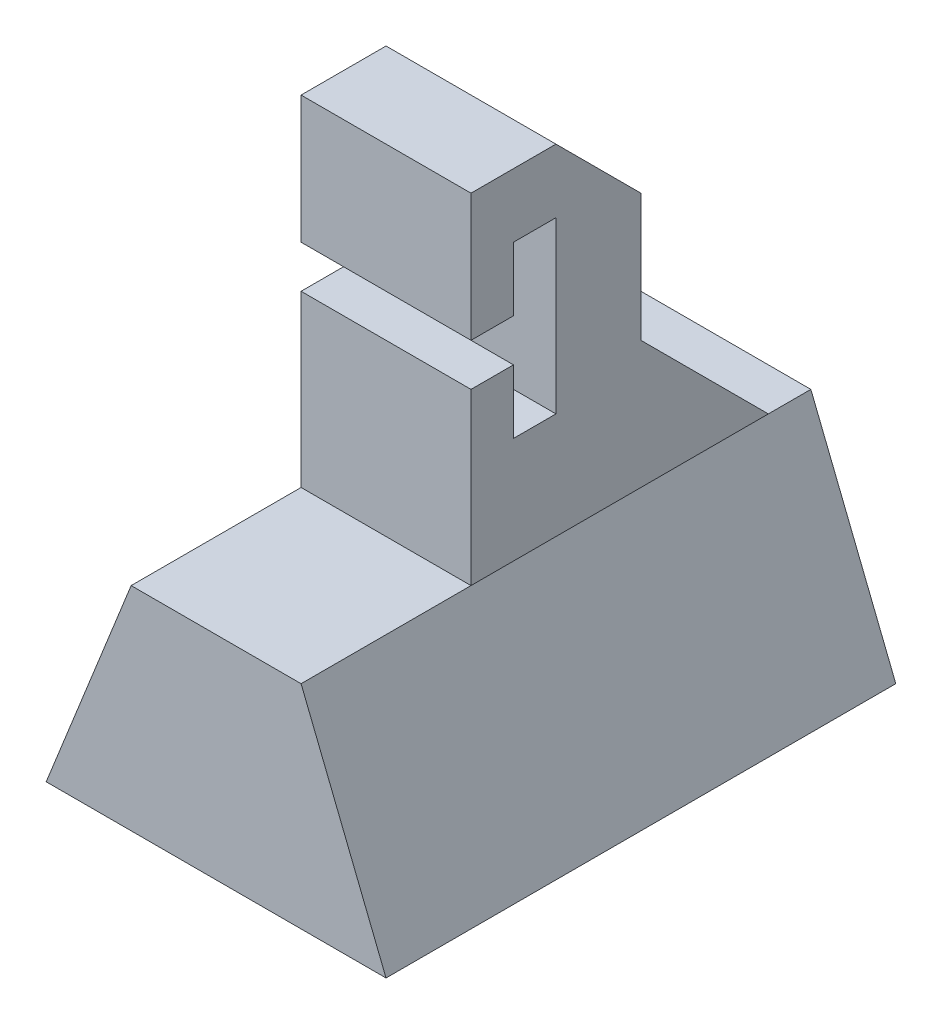
ISO-10303-21;
HEADER;
FILE_DESCRIPTION(('STEP AP214'),'2;1');
FILE_NAME('part.step','',(''),(''),'','','');
FILE_SCHEMA(('AUTOMOTIVE_DESIGN { 1 0 10303 214 1 1 1 1 }'));
ENDSEC;
DATA;
#1=APPLICATION_CONTEXT('core data for automotive mechanical design processes');
#2=APPLICATION_PROTOCOL_DEFINITION('international standard','automotive_design',2000,#1);
#3=PRODUCT_CONTEXT('',#1,'mechanical');
#4=PRODUCT('Part','Part','',(#3));
#5=PRODUCT_RELATED_PRODUCT_CATEGORY('part','',(#4));
#6=PRODUCT_DEFINITION_FORMATION('','',#4);
#7=PRODUCT_DEFINITION_CONTEXT('part definition',#1,'design');
#8=PRODUCT_DEFINITION('design','',#6,#7);
#9=PRODUCT_DEFINITION_SHAPE('','',#8);
#10=(LENGTH_UNIT() NAMED_UNIT(*) SI_UNIT(.MILLI.,.METRE.));
#11=(NAMED_UNIT(*) PLANE_ANGLE_UNIT() SI_UNIT($,.RADIAN.));
#12=(NAMED_UNIT(*) SI_UNIT($,.STERADIAN.) SOLID_ANGLE_UNIT());
#13=UNCERTAINTY_MEASURE_WITH_UNIT(LENGTH_MEASURE(1.E-05),#10,'distance_accuracy_value','');
#14=(GEOMETRIC_REPRESENTATION_CONTEXT(3) GLOBAL_UNCERTAINTY_ASSIGNED_CONTEXT((#13)) GLOBAL_UNIT_ASSIGNED_CONTEXT((#10,
#11,#12)) REPRESENTATION_CONTEXT('',''));
#15=CARTESIAN_POINT('',(0.,0.,0.));
#16=DIRECTION('',(0.,0.,1.));
#17=DIRECTION('',(1.,0.,0.));
#18=AXIS2_PLACEMENT_3D('',#15,#16,#17);
#19=CARTESIAN_POINT('',(-1.1304347826087,10.3913043478261,8.));
#20=DIRECTION('',(0.,0.,-1.));
#21=DIRECTION('',(-1.,0.,0.));
#22=AXIS2_PLACEMENT_3D('',#19,#20,#21);
#23=PLANE('',#22);
#24=DIRECTION('',(0.,-1.,0.));
#25=VECTOR('',#24,1.);
#26=CARTESIAN_POINT('',(2.8695652173913,10.3913043478261,8.));
#27=LINE('',#26,#25);
#28=CARTESIAN_POINT('',(2.8695652173913,6.39130434782609,8.));
#29=VERTEX_POINT('',#28);
#30=CARTESIAN_POINT('',(2.8695652173913,2.39130434782609,8.));
#31=VERTEX_POINT('',#30);
#32=EDGE_CURVE('E184',#29,#31,#27,.T.);
#33=ORIENTED_EDGE('',*,*,#32,.F.);
#34=DIRECTION('',(1.,0.,0.));
#35=VECTOR('',#34,1.);
#36=CARTESIAN_POINT('',(-15.1304347826087,6.39130434782609,8.));
#37=LINE('',#36,#35);
#38=CARTESIAN_POINT('',(-1.1304347826087,6.39130434782609,8.));
#39=VERTEX_POINT('',#38);
#40=EDGE_CURVE('E178',#39,#29,#37,.T.);
#41=ORIENTED_EDGE('',*,*,#40,.F.);
#42=DIRECTION('',(0.,-1.,0.));
#43=VECTOR('',#42,1.);
#44=CARTESIAN_POINT('',(-1.1304347826087,10.3913043478261,8.));
#45=LINE('',#44,#43);
#46=CARTESIAN_POINT('',(-1.1304347826087,2.39130434782609,8.));
#47=VERTEX_POINT('',#46);
#48=EDGE_CURVE('E183',#39,#47,#45,.T.);
#49=ORIENTED_EDGE('',*,*,#48,.T.);
#50=DIRECTION('',(1.,0.,0.));
#51=VECTOR('',#50,1.);
#52=CARTESIAN_POINT('',(-1.1304347826087,2.39130434782609,8.));
#53=LINE('',#52,#51);
#54=EDGE_CURVE('E251',#47,#31,#53,.T.);
#55=ORIENTED_EDGE('',*,*,#54,.T.);
#56=EDGE_LOOP('',(#33,#41,#49,#55));
#57=FACE_BOUND('',#56,.T.);
#58=ADVANCED_FACE('F33',(#57),#23,.F.);
#59=CARTESIAN_POINT('',(2.8695652173913,2.39130434782609,12.));
#60=DIRECTION('',(0.,-1.,0.));
#61=DIRECTION('',(1.,0.,0.));
#62=AXIS2_PLACEMENT_3D('',#59,#60,#61);
#63=PLANE('',#62);
#64=DIRECTION('',(0.,0.,-1.));
#65=VECTOR('',#64,1.);
#66=CARTESIAN_POINT('',(-1.1304347826087,2.39130434782609,12.));
#67=LINE('',#66,#65);
#68=CARTESIAN_POINT('',(-1.1304347826087,2.39130434782609,1.00000000000001));
#69=VERTEX_POINT('',#68);
#70=CARTESIAN_POINT('',(-1.1304347826087,2.39130434782609,0.));
#71=VERTEX_POINT('',#70);
#72=EDGE_CURVE('E202',#69,#71,#67,.T.);
#73=ORIENTED_EDGE('',*,*,#72,.F.);
#74=DIRECTION('',(1.,0.,0.));
#75=VECTOR('',#74,1.);
#76=CARTESIAN_POINT('',(2.8695652173913,2.39130434782609,1.00000000000001));
#77=LINE('',#76,#75);
#78=CARTESIAN_POINT('',(2.8695652173913,2.39130434782609,1.00000000000001));
#79=VERTEX_POINT('',#78);
#80=EDGE_CURVE('E228',#69,#79,#77,.T.);
#81=ORIENTED_EDGE('',*,*,#80,.T.);
#82=DIRECTION('',(0.,0.,-1.));
#83=VECTOR('',#82,1.);
#84=CARTESIAN_POINT('',(2.8695652173913,2.39130434782609,12.));
#85=LINE('',#84,#83);
#86=CARTESIAN_POINT('',(2.8695652173913,2.39130434782609,0.));
#87=VERTEX_POINT('',#86);
#88=EDGE_CURVE('E215',#79,#87,#85,.T.);
#89=ORIENTED_EDGE('',*,*,#88,.T.);
#90=DIRECTION('',(-1.,0.,0.));
#91=VECTOR('',#90,1.);
#92=CARTESIAN_POINT('',(2.8695652173913,2.39130434782609,0.));
#93=LINE('',#92,#91);
#94=EDGE_CURVE('E196',#87,#71,#93,.T.);
#95=ORIENTED_EDGE('',*,*,#94,.T.);
#96=EDGE_LOOP('',(#73,#81,#89,#95));
#97=FACE_BOUND('',#96,.T.);
#98=ADVANCED_FACE('F279',(#97),#63,.F.);
#99=ORIENTED_EDGE('',*,*,#54,.F.);
#100=CARTESIAN_POINT('',(-1.1304347826087,2.39130434782609,12.));
#101=VERTEX_POINT('',#100);
#102=EDGE_CURVE('E212',#101,#47,#67,.T.);
#103=ORIENTED_EDGE('',*,*,#102,.F.);
#104=DIRECTION('',(-1.,0.,0.));
#105=VECTOR('',#104,1.);
#106=CARTESIAN_POINT('',(2.8695652173913,2.39130434782609,12.));
#107=LINE('',#106,#105);
#108=CARTESIAN_POINT('',(2.8695652173913,2.39130434782609,12.));
#109=VERTEX_POINT('',#108);
#110=EDGE_CURVE('E200',#109,#101,#107,.T.);
#111=ORIENTED_EDGE('',*,*,#110,.F.);
#112=EDGE_CURVE('E216',#109,#31,#85,.T.);
#113=ORIENTED_EDGE('',*,*,#112,.T.);
#114=EDGE_LOOP('',(#99,#103,#111,#113));
#115=FACE_BOUND('',#114,.T.);
#116=ADVANCED_FACE('F297',(#115),#63,.F.);
#117=CARTESIAN_POINT('',(-1.1304347826087,2.39130434782609,12.));
#118=DIRECTION('',(0.928476690885259,-0.371390676354104,0.));
#119=DIRECTION('',(0.371390676354104,0.928476690885259,0.));
#120=AXIS2_PLACEMENT_3D('',#117,#118,#119);
#121=PLANE('',#120);
#122=DIRECTION('',(-0.371390676354104,-0.928476690885259,0.));
#123=VECTOR('',#122,1.);
#124=CARTESIAN_POINT('',(-1.1304347826087,2.39130434782609,0.));
#125=LINE('',#124,#123);
#126=CARTESIAN_POINT('',(-3.1304347826087,-2.60869565217391,0.));
#127=VERTEX_POINT('',#126);
#128=EDGE_CURVE('E191',#71,#127,#125,.T.);
#129=ORIENTED_EDGE('',*,*,#128,.T.);
#130=DIRECTION('',(0.,0.,-1.));
#131=VECTOR('',#130,1.);
#132=CARTESIAN_POINT('',(-3.1304347826087,-2.60869565217391,12.));
#133=LINE('',#132,#131);
#134=CARTESIAN_POINT('',(-3.1304347826087,-2.60869565217391,12.));
#135=VERTEX_POINT('',#134);
#136=EDGE_CURVE('E222',#135,#127,#133,.T.);
#137=ORIENTED_EDGE('',*,*,#136,.F.);
#138=DIRECTION('',(-0.371390676354104,-0.928476690885259,0.));
#139=VECTOR('',#138,1.);
#140=CARTESIAN_POINT('',(-1.1304347826087,2.39130434782609,12.));
#141=LINE('',#140,#139);
#142=EDGE_CURVE('E192',#101,#135,#141,.T.);
#143=ORIENTED_EDGE('',*,*,#142,.F.);
#144=ORIENTED_EDGE('',*,*,#102,.T.);
#145=DIRECTION('',(0.,0.,1.));
#146=VECTOR('',#145,1.);
#147=CARTESIAN_POINT('',(-1.1304347826087,2.39130434782609,4.));
#148=LINE('',#147,#146);
#149=EDGE_CURVE('E259',#69,#47,#148,.T.);
#150=ORIENTED_EDGE('',*,*,#149,.F.);
#151=ORIENTED_EDGE('',*,*,#72,.T.);
#152=EDGE_LOOP('',(#129,#137,#143,#144,#150,#151));
#153=FACE_BOUND('',#152,.T.);
#154=ADVANCED_FACE('F275',(#153),#121,.F.);
#155=CARTESIAN_POINT('',(-3.1304347826087,-2.60869565217391,12.));
#156=DIRECTION('',(0.,1.,0.));
#157=DIRECTION('',(0.,0.,1.));
#158=AXIS2_PLACEMENT_3D('',#155,#156,#157);
#159=PLANE('',#158);
#160=DIRECTION('',(1.,0.,0.));
#161=VECTOR('',#160,1.);
#162=CARTESIAN_POINT('',(-3.1304347826087,-2.60869565217391,0.));
#163=LINE('',#162,#161);
#164=CARTESIAN_POINT('',(4.8695652173913,-2.60869565217391,0.));
#165=VERTEX_POINT('',#164);
#166=EDGE_CURVE('E205',#127,#165,#163,.T.);
#167=ORIENTED_EDGE('',*,*,#166,.T.);
#168=DIRECTION('',(0.,0.,-1.));
#169=VECTOR('',#168,1.);
#170=CARTESIAN_POINT('',(4.8695652173913,-2.60869565217391,12.));
#171=LINE('',#170,#169);
#172=CARTESIAN_POINT('',(4.8695652173913,-2.60869565217391,12.));
#173=VERTEX_POINT('',#172);
#174=EDGE_CURVE('E219',#173,#165,#171,.T.);
#175=ORIENTED_EDGE('',*,*,#174,.F.);
#176=DIRECTION('',(1.,0.,0.));
#177=VECTOR('',#176,1.);
#178=CARTESIAN_POINT('',(-3.1304347826087,-2.60869565217391,12.));
#179=LINE('',#178,#177);
#180=EDGE_CURVE('E195',#135,#173,#179,.T.);
#181=ORIENTED_EDGE('',*,*,#180,.F.);
#182=ORIENTED_EDGE('',*,*,#136,.T.);
#183=EDGE_LOOP('',(#167,#175,#181,#182));
#184=FACE_BOUND('',#183,.T.);
#185=ADVANCED_FACE('F288',(#184),#159,.F.);
#186=CARTESIAN_POINT('',(4.8695652173913,-2.60869565217391,12.));
#187=DIRECTION('',(-0.928476690885259,-0.371390676354103,0.));
#188=DIRECTION('',(0.371390676354104,-0.928476690885259,0.));
#189=AXIS2_PLACEMENT_3D('',#186,#187,#188);
#190=PLANE('',#189);
#191=DIRECTION('',(-0.371390676354104,0.928476690885259,0.));
#192=VECTOR('',#191,1.);
#193=CARTESIAN_POINT('',(4.8695652173913,-2.60869565217391,0.));
#194=LINE('',#193,#192);
#195=EDGE_CURVE('E207',#165,#87,#194,.T.);
#196=ORIENTED_EDGE('',*,*,#195,.T.);
#197=ORIENTED_EDGE('',*,*,#88,.F.);
#198=DIRECTION('',(0.,0.,-1.));
#199=VECTOR('',#198,1.);
#200=CARTESIAN_POINT('',(2.8695652173913,2.39130434782609,4.));
#201=LINE('',#200,#199);
#202=EDGE_CURVE('E248',#31,#79,#201,.T.);
#203=ORIENTED_EDGE('',*,*,#202,.F.);
#204=ORIENTED_EDGE('',*,*,#112,.F.);
#205=DIRECTION('',(-0.371390676354104,0.928476690885259,0.));
#206=VECTOR('',#205,1.);
#207=CARTESIAN_POINT('',(4.8695652173913,-2.60869565217391,12.));
#208=LINE('',#207,#206);
#209=EDGE_CURVE('E198',#173,#109,#208,.T.);
#210=ORIENTED_EDGE('',*,*,#209,.F.);
#211=ORIENTED_EDGE('',*,*,#174,.T.);
#212=EDGE_LOOP('',(#196,#197,#203,#204,#210,#211));
#213=FACE_BOUND('',#212,.T.);
#214=ADVANCED_FACE('F393',(#213),#190,.F.);
#215=CARTESIAN_POINT('',(0.,0.,12.));
#216=DIRECTION('',(0.,0.,1.));
#217=DIRECTION('',(1.,0.,0.));
#218=AXIS2_PLACEMENT_3D('',#215,#216,#217);
#219=PLANE('',#218);
#220=ORIENTED_EDGE('',*,*,#142,.T.);
#221=ORIENTED_EDGE('',*,*,#180,.T.);
#222=ORIENTED_EDGE('',*,*,#209,.T.);
#223=ORIENTED_EDGE('',*,*,#110,.T.);
#224=EDGE_LOOP('',(#220,#221,#222,#223));
#225=FACE_BOUND('',#224,.T.);
#226=ADVANCED_FACE('F292',(#225),#219,.T.);
#227=CARTESIAN_POINT('',(0.,0.,0.));
#228=DIRECTION('',(0.,0.,1.));
#229=DIRECTION('',(1.,0.,0.));
#230=AXIS2_PLACEMENT_3D('',#227,#228,#229);
#231=PLANE('',#230);
#232=ORIENTED_EDGE('',*,*,#128,.F.);
#233=ORIENTED_EDGE('',*,*,#94,.F.);
#234=ORIENTED_EDGE('',*,*,#195,.F.);
#235=ORIENTED_EDGE('',*,*,#166,.F.);
#236=EDGE_LOOP('',(#232,#233,#234,#235));
#237=FACE_BOUND('',#236,.T.);
#238=ADVANCED_FACE('F285',(#237),#231,.F.);
#239=CARTESIAN_POINT('',(-1.1304347826087,10.3913043478261,4.));
#240=DIRECTION('',(1.,0.,0.));
#241=DIRECTION('',(0.,1.,0.));
#242=AXIS2_PLACEMENT_3D('',#239,#240,#241);
#243=PLANE('',#242);
#244=DIRECTION('',(0.,0.,1.));
#245=VECTOR('',#244,1.);
#246=CARTESIAN_POINT('',(-1.1304347826087,10.3913043478261,4.));
#247=LINE('',#246,#245);
#248=CARTESIAN_POINT('',(-1.1304347826087,10.3913043478261,6.));
#249=VERTEX_POINT('',#248);
#250=CARTESIAN_POINT('',(-1.1304347826087,10.3913043478261,8.));
#251=VERTEX_POINT('',#250);
#252=EDGE_CURVE('E243',#249,#251,#247,.T.);
#253=ORIENTED_EDGE('',*,*,#252,.F.);
#254=DIRECTION('',(0.,-0.707106781186549,-0.707106781186546));
#255=VECTOR('',#254,1.);
#256=CARTESIAN_POINT('',(-1.1304347826087,10.3913043478261,6.));
#257=LINE('',#256,#255);
#258=CARTESIAN_POINT('',(-1.1304347826087,8.39130434782609,4.));
#259=VERTEX_POINT('',#258);
#260=EDGE_CURVE('E55',#249,#259,#257,.T.);
#261=ORIENTED_EDGE('',*,*,#260,.T.);
#262=DIRECTION('',(0.,-1.,0.));
#263=VECTOR('',#262,1.);
#264=CARTESIAN_POINT('',(-1.1304347826087,10.3913043478261,4.));
#265=LINE('',#264,#263);
#266=CARTESIAN_POINT('',(-1.1304347826087,5.39130434782611,4.));
#267=VERTEX_POINT('',#266);
#268=EDGE_CURVE('E258',#259,#267,#265,.T.);
#269=ORIENTED_EDGE('',*,*,#268,.T.);
#270=DIRECTION('',(0.,0.707106781186551,0.707106781186544));
#271=VECTOR('',#270,1.);
#272=CARTESIAN_POINT('',(-1.1304347826087,7.89130434782613,6.49999999999999));
#273=LINE('',#272,#271);
#274=EDGE_CURVE('E231',#267,#69,#273,.F.);
#275=ORIENTED_EDGE('',*,*,#274,.T.);
#276=ORIENTED_EDGE('',*,*,#149,.T.);
#277=ORIENTED_EDGE('',*,*,#48,.F.);
#278=DIRECTION('',(0.,0.,-1.));
#279=VECTOR('',#278,1.);
#280=CARTESIAN_POINT('',(-1.1304347826087,6.39130434782609,4.));
#281=LINE('',#280,#279);
#282=CARTESIAN_POINT('',(-1.1304347826087,6.39130434782609,7.));
#283=VERTEX_POINT('',#282);
#284=EDGE_CURVE('E314',#39,#283,#281,.T.);
#285=ORIENTED_EDGE('',*,*,#284,.T.);
#286=DIRECTION('',(0.,-1.,0.));
#287=VECTOR('',#286,1.);
#288=CARTESIAN_POINT('',(-1.1304347826087,10.3913043478261,7.));
#289=LINE('',#288,#287);
#290=CARTESIAN_POINT('',(-1.1304347826087,4.89130434782609,7.));
#291=VERTEX_POINT('',#290);
#292=EDGE_CURVE('E317',#283,#291,#289,.T.);
#293=ORIENTED_EDGE('',*,*,#292,.T.);
#294=DIRECTION('',(0.,0.,-1.));
#295=VECTOR('',#294,1.);
#296=CARTESIAN_POINT('',(-1.1304347826087,4.89130434782609,4.));
#297=LINE('',#296,#295);
#298=CARTESIAN_POINT('',(-1.1304347826087,4.89130434782609,6.));
#299=VERTEX_POINT('',#298);
#300=EDGE_CURVE('E320',#291,#299,#297,.T.);
#301=ORIENTED_EDGE('',*,*,#300,.T.);
#302=DIRECTION('',(0.,1.,0.));
#303=VECTOR('',#302,1.);
#304=CARTESIAN_POINT('',(-1.1304347826087,10.3913043478261,6.));
#305=LINE('',#304,#303);
#306=CARTESIAN_POINT('',(-1.1304347826087,8.89130434782609,6.));
#307=VERTEX_POINT('',#306);
#308=EDGE_CURVE('E323',#299,#307,#305,.T.);
#309=ORIENTED_EDGE('',*,*,#308,.T.);
#310=DIRECTION('',(0.,0.,1.));
#311=VECTOR('',#310,1.);
#312=CARTESIAN_POINT('',(-1.1304347826087,8.89130434782609,4.));
#313=LINE('',#312,#311);
#314=CARTESIAN_POINT('',(-1.1304347826087,8.89130434782609,7.));
#315=VERTEX_POINT('',#314);
#316=EDGE_CURVE('E325',#307,#315,#313,.T.);
#317=ORIENTED_EDGE('',*,*,#316,.T.);
#318=DIRECTION('',(0.,-1.,0.));
#319=VECTOR('',#318,1.);
#320=CARTESIAN_POINT('',(-1.1304347826087,10.3913043478261,7.));
#321=LINE('',#320,#319);
#322=CARTESIAN_POINT('',(-1.1304347826087,7.39130434782609,7.));
#323=VERTEX_POINT('',#322);
#324=EDGE_CURVE('E254',#315,#323,#321,.T.);
#325=ORIENTED_EDGE('',*,*,#324,.T.);
#326=DIRECTION('',(0.,0.,1.));
#327=VECTOR('',#326,1.);
#328=CARTESIAN_POINT('',(-1.1304347826087,7.39130434782609,4.));
#329=LINE('',#328,#327);
#330=CARTESIAN_POINT('',(-1.1304347826087,7.39130434782609,8.));
#331=VERTEX_POINT('',#330);
#332=EDGE_CURVE('E312',#323,#331,#329,.T.);
#333=ORIENTED_EDGE('',*,*,#332,.T.);
#334=EDGE_CURVE('E177',#251,#331,#45,.T.);
#335=ORIENTED_EDGE('',*,*,#334,.F.);
#336=EDGE_LOOP('',(#253,#261,#269,#275,#276,#277,#285,#293,#301,#309,#317,#325,#333,#335));
#337=FACE_BOUND('',#336,.T.);
#338=ADVANCED_FACE('F246',(#337),#243,.F.);
#339=ORIENTED_EDGE('',*,*,#334,.T.);
#340=DIRECTION('',(1.,0.,0.));
#341=VECTOR('',#340,1.);
#342=CARTESIAN_POINT('',(-15.1304347826087,7.39130434782609,8.));
#343=LINE('',#342,#341);
#344=CARTESIAN_POINT('',(2.8695652173913,7.39130434782609,8.));
#345=VERTEX_POINT('',#344);
#346=EDGE_CURVE('E159',#331,#345,#343,.T.);
#347=ORIENTED_EDGE('',*,*,#346,.T.);
#348=CARTESIAN_POINT('',(2.8695652173913,10.3913043478261,8.));
#349=VERTEX_POINT('',#348);
#350=EDGE_CURVE('E174',#349,#345,#27,.T.);
#351=ORIENTED_EDGE('',*,*,#350,.F.);
#352=DIRECTION('',(1.,0.,0.));
#353=VECTOR('',#352,1.);
#354=CARTESIAN_POINT('',(-1.1304347826087,10.3913043478261,8.));
#355=LINE('',#354,#353);
#356=EDGE_CURVE('E247',#251,#349,#355,.T.);
#357=ORIENTED_EDGE('',*,*,#356,.F.);
#358=EDGE_LOOP('',(#339,#347,#351,#357));
#359=FACE_BOUND('',#358,.T.);
#360=ADVANCED_FACE('F172',(#359),#23,.F.);
#361=CARTESIAN_POINT('',(2.8695652173913,10.3913043478261,4.));
#362=DIRECTION('',(-1.,0.,0.));
#363=DIRECTION('',(0.,-1.,0.));
#364=AXIS2_PLACEMENT_3D('',#361,#362,#363);
#365=PLANE('',#364);
#366=DIRECTION('',(0.,-1.,0.));
#367=VECTOR('',#366,1.);
#368=CARTESIAN_POINT('',(2.8695652173913,10.3913043478261,4.));
#369=LINE('',#368,#367);
#370=CARTESIAN_POINT('',(2.8695652173913,8.39130434782609,4.));
#371=VERTEX_POINT('',#370);
#372=CARTESIAN_POINT('',(2.8695652173913,5.39130434782611,4.));
#373=VERTEX_POINT('',#372);
#374=EDGE_CURVE('E187',#371,#373,#369,.T.);
#375=ORIENTED_EDGE('',*,*,#374,.F.);
#376=DIRECTION('',(0.,0.707106781186549,0.707106781186546));
#377=VECTOR('',#376,1.);
#378=CARTESIAN_POINT('',(2.8695652173913,10.3913043478261,6.));
#379=LINE('',#378,#377);
#380=CARTESIAN_POINT('',(2.8695652173913,10.3913043478261,6.));
#381=VERTEX_POINT('',#380);
#382=EDGE_CURVE('E11',#371,#381,#379,.T.);
#383=ORIENTED_EDGE('',*,*,#382,.T.);
#384=DIRECTION('',(0.,0.,-1.));
#385=VECTOR('',#384,1.);
#386=CARTESIAN_POINT('',(2.8695652173913,10.3913043478261,4.));
#387=LINE('',#386,#385);
#388=EDGE_CURVE('E182',#349,#381,#387,.T.);
#389=ORIENTED_EDGE('',*,*,#388,.F.);
#390=ORIENTED_EDGE('',*,*,#350,.T.);
#391=DIRECTION('',(0.,0.,1.));
#392=VECTOR('',#391,1.);
#393=CARTESIAN_POINT('',(2.8695652173913,7.39130434782609,7.));
#394=LINE('',#393,#392);
#395=CARTESIAN_POINT('',(2.8695652173913,7.39130434782609,7.));
#396=VERTEX_POINT('',#395);
#397=EDGE_CURVE('E156',#396,#345,#394,.T.);
#398=ORIENTED_EDGE('',*,*,#397,.F.);
#399=DIRECTION('',(0.,-1.,0.));
#400=VECTOR('',#399,1.);
#401=CARTESIAN_POINT('',(2.8695652173913,8.89130434782609,7.));
#402=LINE('',#401,#400);
#403=CARTESIAN_POINT('',(2.8695652173913,8.89130434782609,7.));
#404=VERTEX_POINT('',#403);
#405=EDGE_CURVE('E167',#404,#396,#402,.T.);
#406=ORIENTED_EDGE('',*,*,#405,.F.);
#407=DIRECTION('',(0.,0.,1.));
#408=VECTOR('',#407,1.);
#409=CARTESIAN_POINT('',(2.8695652173913,8.89130434782609,7.));
#410=LINE('',#409,#408);
#411=CARTESIAN_POINT('',(2.8695652173913,8.89130434782609,6.));
#412=VERTEX_POINT('',#411);
#413=EDGE_CURVE('E311',#412,#404,#410,.T.);
#414=ORIENTED_EDGE('',*,*,#413,.F.);
#415=DIRECTION('',(0.,1.,0.));
#416=VECTOR('',#415,1.);
#417=CARTESIAN_POINT('',(2.8695652173913,8.89130434782609,6.));
#418=LINE('',#417,#416);
#419=CARTESIAN_POINT('',(2.8695652173913,4.89130434782609,6.));
#420=VERTEX_POINT('',#419);
#421=EDGE_CURVE('E359',#420,#412,#418,.T.);
#422=ORIENTED_EDGE('',*,*,#421,.F.);
#423=DIRECTION('',(0.,0.,-1.));
#424=VECTOR('',#423,1.);
#425=CARTESIAN_POINT('',(2.8695652173913,4.89130434782609,7.));
#426=LINE('',#425,#424);
#427=CARTESIAN_POINT('',(2.8695652173913,4.89130434782609,7.));
#428=VERTEX_POINT('',#427);
#429=EDGE_CURVE('E350',#428,#420,#426,.T.);
#430=ORIENTED_EDGE('',*,*,#429,.F.);
#431=DIRECTION('',(0.,-1.,0.));
#432=VECTOR('',#431,1.);
#433=CARTESIAN_POINT('',(2.8695652173913,6.39130434782609,7.));
#434=LINE('',#433,#432);
#435=CARTESIAN_POINT('',(2.8695652173913,6.39130434782609,7.));
#436=VERTEX_POINT('',#435);
#437=EDGE_CURVE('E354',#436,#428,#434,.T.);
#438=ORIENTED_EDGE('',*,*,#437,.F.);
#439=DIRECTION('',(0.,0.,-1.));
#440=VECTOR('',#439,1.);
#441=CARTESIAN_POINT('',(2.8695652173913,6.39130434782609,7.));
#442=LINE('',#441,#440);
#443=EDGE_CURVE('E166',#29,#436,#442,.T.);
#444=ORIENTED_EDGE('',*,*,#443,.F.);
#445=ORIENTED_EDGE('',*,*,#32,.T.);
#446=ORIENTED_EDGE('',*,*,#202,.T.);
#447=DIRECTION('',(0.,-0.707106781186551,-0.707106781186544));
#448=VECTOR('',#447,1.);
#449=CARTESIAN_POINT('',(2.8695652173913,7.89130434782613,6.49999999999999));
#450=LINE('',#449,#448);
#451=EDGE_CURVE('E234',#79,#373,#450,.F.);
#452=ORIENTED_EDGE('',*,*,#451,.T.);
#453=EDGE_LOOP('',(#375,#383,#389,#390,#398,#406,#414,#422,#430,#438,#444,#445,#446,#452));
#454=FACE_BOUND('',#453,.T.);
#455=ADVANCED_FACE('F180',(#454),#365,.F.);
#456=CARTESIAN_POINT('',(-1.1304347826087,10.3913043478261,4.));
#457=DIRECTION('',(0.,0.,1.));
#458=DIRECTION('',(1.,0.,0.));
#459=AXIS2_PLACEMENT_3D('',#456,#457,#458);
#460=PLANE('',#459);
#461=ORIENTED_EDGE('',*,*,#268,.F.);
#462=DIRECTION('',(1.,0.,0.));
#463=VECTOR('',#462,1.);
#464=CARTESIAN_POINT('',(2.8695652173913,8.39130434782609,4.));
#465=LINE('',#464,#463);
#466=EDGE_CURVE('E41',#259,#371,#465,.T.);
#467=ORIENTED_EDGE('',*,*,#466,.T.);
#468=ORIENTED_EDGE('',*,*,#374,.T.);
#469=DIRECTION('',(-1.,0.,0.));
#470=VECTOR('',#469,1.);
#471=CARTESIAN_POINT('',(-1.1304347826087,5.39130434782611,4.));
#472=LINE('',#471,#470);
#473=EDGE_CURVE('E225',#373,#267,#472,.T.);
#474=ORIENTED_EDGE('',*,*,#473,.T.);
#475=EDGE_LOOP('',(#461,#467,#468,#474));
#476=FACE_BOUND('',#475,.T.);
#477=ADVANCED_FACE('F264',(#476),#460,.F.);
#478=CARTESIAN_POINT('',(0.,10.3913043478261,0.));
#479=DIRECTION('',(0.,1.,0.));
#480=DIRECTION('',(-1.,0.,0.));
#481=AXIS2_PLACEMENT_3D('',#478,#479,#480);
#482=PLANE('',#481);
#483=ORIENTED_EDGE('',*,*,#388,.T.);
#484=DIRECTION('',(-1.,0.,0.));
#485=VECTOR('',#484,1.);
#486=CARTESIAN_POINT('',(-1.1304347826087,10.3913043478261,6.));
#487=LINE('',#486,#485);
#488=EDGE_CURVE('E237',#381,#249,#487,.T.);
#489=ORIENTED_EDGE('',*,*,#488,.T.);
#490=ORIENTED_EDGE('',*,*,#252,.T.);
#491=ORIENTED_EDGE('',*,*,#356,.T.);
#492=EDGE_LOOP('',(#483,#489,#490,#491));
#493=FACE_BOUND('',#492,.T.);
#494=ADVANCED_FACE('F242',(#493),#482,.T.);
#495=CARTESIAN_POINT('',(-1.1304347826087,5.39130434782611,4.));
#496=DIRECTION('',(0.,0.707106781186544,-0.707106781186551));
#497=DIRECTION('',(1.,0.,0.));
#498=AXIS2_PLACEMENT_3D('',#495,#496,#497);
#499=PLANE('',#498);
#500=ORIENTED_EDGE('',*,*,#451,.F.);
#501=ORIENTED_EDGE('',*,*,#80,.F.);
#502=ORIENTED_EDGE('',*,*,#274,.F.);
#503=ORIENTED_EDGE('',*,*,#473,.F.);
#504=EDGE_LOOP('',(#500,#501,#502,#503));
#505=FACE_BOUND('',#504,.T.);
#506=ADVANCED_FACE('F270',(#505),#499,.T.);
#507=CARTESIAN_POINT('',(-15.1304347826087,8.89130434782609,7.));
#508=DIRECTION('',(0.,0.,1.));
#509=DIRECTION('',(1.,0.,0.));
#510=AXIS2_PLACEMENT_3D('',#507,#508,#509);
#511=PLANE('',#510);
#512=DIRECTION('',(1.,0.,0.));
#513=VECTOR('',#512,1.);
#514=CARTESIAN_POINT('',(-15.1304347826087,8.89130434782609,7.));
#515=LINE('',#514,#513);
#516=EDGE_CURVE('E315',#315,#404,#515,.T.);
#517=ORIENTED_EDGE('',*,*,#516,.T.);
#518=ORIENTED_EDGE('',*,*,#405,.T.);
#519=DIRECTION('',(1.,0.,0.));
#520=VECTOR('',#519,1.);
#521=CARTESIAN_POINT('',(-15.1304347826087,7.39130434782609,7.));
#522=LINE('',#521,#520);
#523=EDGE_CURVE('E162',#323,#396,#522,.T.);
#524=ORIENTED_EDGE('',*,*,#523,.F.);
#525=ORIENTED_EDGE('',*,*,#324,.F.);
#526=EDGE_LOOP('',(#517,#518,#524,#525));
#527=FACE_BOUND('',#526,.T.);
#528=ADVANCED_FACE('F330',(#527),#511,.F.);
#529=CARTESIAN_POINT('',(-15.1304347826087,8.89130434782609,7.));
#530=DIRECTION('',(0.,1.,0.));
#531=DIRECTION('',(-1.,0.,0.));
#532=AXIS2_PLACEMENT_3D('',#529,#530,#531);
#533=PLANE('',#532);
#534=DIRECTION('',(1.,0.,0.));
#535=VECTOR('',#534,1.);
#536=CARTESIAN_POINT('',(-15.1304347826087,8.89130434782609,6.));
#537=LINE('',#536,#535);
#538=EDGE_CURVE('E336',#307,#412,#537,.T.);
#539=ORIENTED_EDGE('',*,*,#538,.T.);
#540=ORIENTED_EDGE('',*,*,#413,.T.);
#541=ORIENTED_EDGE('',*,*,#516,.F.);
#542=ORIENTED_EDGE('',*,*,#316,.F.);
#543=EDGE_LOOP('',(#539,#540,#541,#542));
#544=FACE_BOUND('',#543,.T.);
#545=ADVANCED_FACE('F333',(#544),#533,.F.);
#546=CARTESIAN_POINT('',(-15.1304347826087,8.89130434782609,6.));
#547=DIRECTION('',(0.,0.,-1.));
#548=DIRECTION('',(0.,1.,0.));
#549=AXIS2_PLACEMENT_3D('',#546,#547,#548);
#550=PLANE('',#549);
#551=DIRECTION('',(1.,0.,0.));
#552=VECTOR('',#551,1.);
#553=CARTESIAN_POINT('',(-15.1304347826087,4.89130434782609,6.));
#554=LINE('',#553,#552);
#555=EDGE_CURVE('E338',#299,#420,#554,.T.);
#556=ORIENTED_EDGE('',*,*,#555,.T.);
#557=ORIENTED_EDGE('',*,*,#421,.T.);
#558=ORIENTED_EDGE('',*,*,#538,.F.);
#559=ORIENTED_EDGE('',*,*,#308,.F.);
#560=EDGE_LOOP('',(#556,#557,#558,#559));
#561=FACE_BOUND('',#560,.T.);
#562=ADVANCED_FACE('F365',(#561),#550,.F.);
#563=CARTESIAN_POINT('',(-15.1304347826087,4.89130434782609,7.));
#564=DIRECTION('',(0.,-1.,0.));
#565=DIRECTION('',(1.,0.,0.));
#566=AXIS2_PLACEMENT_3D('',#563,#564,#565);
#567=PLANE('',#566);
#568=DIRECTION('',(1.,0.,0.));
#569=VECTOR('',#568,1.);
#570=CARTESIAN_POINT('',(-15.1304347826087,4.89130434782609,7.));
#571=LINE('',#570,#569);
#572=EDGE_CURVE('E306',#291,#428,#571,.T.);
#573=ORIENTED_EDGE('',*,*,#572,.T.);
#574=ORIENTED_EDGE('',*,*,#429,.T.);
#575=ORIENTED_EDGE('',*,*,#555,.F.);
#576=ORIENTED_EDGE('',*,*,#300,.F.);
#577=EDGE_LOOP('',(#573,#574,#575,#576));
#578=FACE_BOUND('',#577,.T.);
#579=ADVANCED_FACE('F347',(#578),#567,.F.);
#580=CARTESIAN_POINT('',(-15.1304347826087,6.39130434782609,7.));
#581=DIRECTION('',(0.,0.,1.));
#582=DIRECTION('',(0.,-1.,0.));
#583=AXIS2_PLACEMENT_3D('',#580,#581,#582);
#584=PLANE('',#583);
#585=DIRECTION('',(1.,0.,0.));
#586=VECTOR('',#585,1.);
#587=CARTESIAN_POINT('',(-15.1304347826087,6.39130434782609,7.));
#588=LINE('',#587,#586);
#589=EDGE_CURVE('E304',#283,#436,#588,.T.);
#590=ORIENTED_EDGE('',*,*,#589,.T.);
#591=ORIENTED_EDGE('',*,*,#437,.T.);
#592=ORIENTED_EDGE('',*,*,#572,.F.);
#593=ORIENTED_EDGE('',*,*,#292,.F.);
#594=EDGE_LOOP('',(#590,#591,#592,#593));
#595=FACE_BOUND('',#594,.T.);
#596=ADVANCED_FACE('F355',(#595),#584,.F.);
#597=CARTESIAN_POINT('',(-15.1304347826087,6.39130434782609,7.));
#598=DIRECTION('',(0.,-1.,0.));
#599=DIRECTION('',(1.,0.,0.));
#600=AXIS2_PLACEMENT_3D('',#597,#598,#599);
#601=PLANE('',#600);
#602=ORIENTED_EDGE('',*,*,#40,.T.);
#603=ORIENTED_EDGE('',*,*,#443,.T.);
#604=ORIENTED_EDGE('',*,*,#589,.F.);
#605=ORIENTED_EDGE('',*,*,#284,.F.);
#606=EDGE_LOOP('',(#602,#603,#604,#605));
#607=FACE_BOUND('',#606,.T.);
#608=ADVANCED_FACE('F363',(#607),#601,.F.);
#609=CARTESIAN_POINT('',(-15.1304347826087,7.39130434782609,7.));
#610=DIRECTION('',(0.,1.,0.));
#611=DIRECTION('',(-1.,0.,0.));
#612=AXIS2_PLACEMENT_3D('',#609,#610,#611);
#613=PLANE('',#612);
#614=ORIENTED_EDGE('',*,*,#523,.T.);
#615=ORIENTED_EDGE('',*,*,#397,.T.);
#616=ORIENTED_EDGE('',*,*,#346,.F.);
#617=ORIENTED_EDGE('',*,*,#332,.F.);
#618=EDGE_LOOP('',(#614,#615,#616,#617));
#619=FACE_BOUND('',#618,.T.);
#620=ADVANCED_FACE('F158',(#619),#613,.F.);
#621=CARTESIAN_POINT('',(0.,10.3913043478261,6.));
#622=DIRECTION('',(0.,0.707106781186546,-0.707106781186549));
#623=DIRECTION('',(1.,0.,0.));
#624=AXIS2_PLACEMENT_3D('',#621,#622,#623);
#625=PLANE('',#624);
#626=ORIENTED_EDGE('',*,*,#382,.F.);
#627=ORIENTED_EDGE('',*,*,#466,.F.);
#628=ORIENTED_EDGE('',*,*,#260,.F.);
#629=ORIENTED_EDGE('',*,*,#488,.F.);
#630=EDGE_LOOP('',(#626,#627,#628,#629));
#631=FACE_BOUND('',#630,.T.);
#632=ADVANCED_FACE('F35',(#631),#625,.T.);
#633=CLOSED_SHELL('',(#58,#98,#116,#154,#185,#214,#226,#238,#338,#360,#455,#477,#494,#506,#528,
#545,#562,#579,#596,#608,#620,#632));
#634=MANIFOLD_SOLID_BREP('B2',#633);
#635=ADVANCED_BREP_SHAPE_REPRESENTATION('',(#18,#634),#14);
#636=SHAPE_DEFINITION_REPRESENTATION(#9,#635);
ENDSEC;
END-ISO-10303-21;
